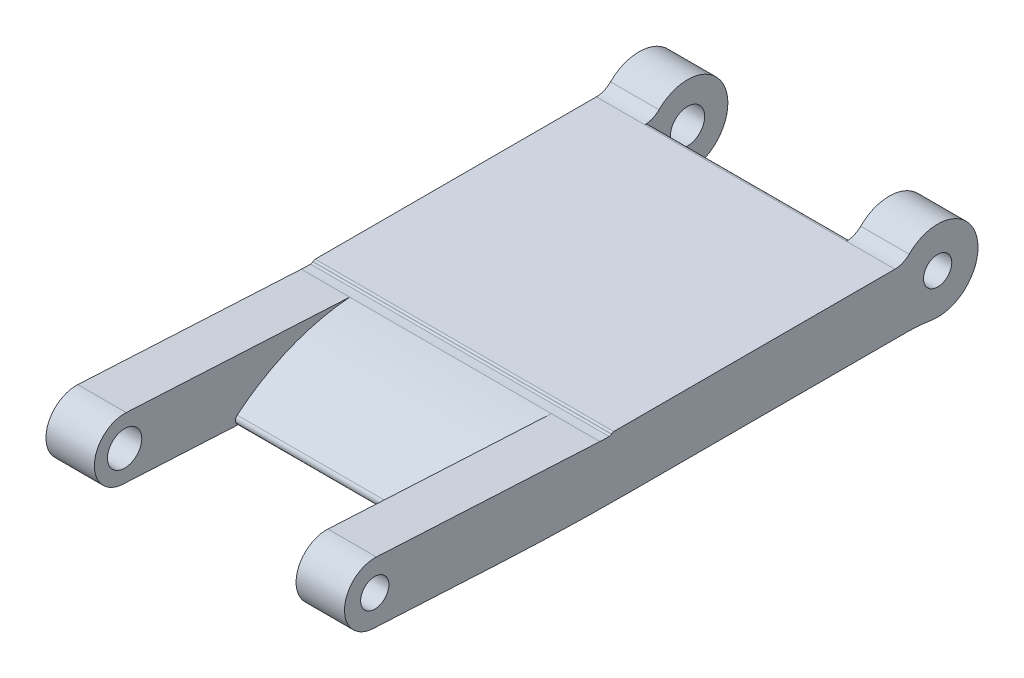
ISO-10303-21;
HEADER;
FILE_DESCRIPTION(('STEP AP214'),'2;1');
FILE_NAME('part.step','',(''),(''),'','','');
FILE_SCHEMA(('AUTOMOTIVE_DESIGN { 1 0 10303 214 1 1 1 1 }'));
ENDSEC;
DATA;
#1=APPLICATION_CONTEXT('core data for automotive mechanical design processes');
#2=APPLICATION_PROTOCOL_DEFINITION('international standard','automotive_design',2000,#1);
#3=PRODUCT_CONTEXT('',#1,'mechanical');
#4=PRODUCT('Part','Part','',(#3));
#5=PRODUCT_RELATED_PRODUCT_CATEGORY('part','',(#4));
#6=PRODUCT_DEFINITION_FORMATION('','',#4);
#7=PRODUCT_DEFINITION_CONTEXT('part definition',#1,'design');
#8=PRODUCT_DEFINITION('design','',#6,#7);
#9=PRODUCT_DEFINITION_SHAPE('','',#8);
#10=(LENGTH_UNIT() NAMED_UNIT(*) SI_UNIT(.MILLI.,.METRE.));
#11=(NAMED_UNIT(*) PLANE_ANGLE_UNIT() SI_UNIT($,.RADIAN.));
#12=(NAMED_UNIT(*) SI_UNIT($,.STERADIAN.) SOLID_ANGLE_UNIT());
#13=UNCERTAINTY_MEASURE_WITH_UNIT(LENGTH_MEASURE(1.E-05),#10,'distance_accuracy_value','');
#14=(GEOMETRIC_REPRESENTATION_CONTEXT(3) GLOBAL_UNCERTAINTY_ASSIGNED_CONTEXT((#13)) GLOBAL_UNIT_ASSIGNED_CONTEXT((#10,
#11,#12)) REPRESENTATION_CONTEXT('',''));
#15=CARTESIAN_POINT('',(0.,0.,0.));
#16=DIRECTION('',(0.,0.,1.));
#17=DIRECTION('',(1.,0.,0.));
#18=AXIS2_PLACEMENT_3D('',#15,#16,#17);
#19=CARTESIAN_POINT('',(12.533154362619,-35.1057047262083,-0.377323929196616));
#20=DIRECTION('',(-1.,0.,0.));
#21=DIRECTION('',(0.,0.,1.));
#22=AXIS2_PLACEMENT_3D('',#19,#20,#21);
#23=CYLINDRICAL_SURFACE('',#22,20.);
#24=DIRECTION('',(-1.,0.,0.));
#25=VECTOR('',#24,1.);
#26=CARTESIAN_POINT('',(12.533154362619,-19.7242130805713,12.4058570033882));
#27=LINE('',#26,#25);
#28=CARTESIAN_POINT('',(-30.,-19.7242130805713,12.4058570033882));
#29=VERTEX_POINT('',#28);
#30=CARTESIAN_POINT('',(-50.,-19.7242130805713,12.4058570033882));
#31=VERTEX_POINT('',#30);
#32=EDGE_CURVE('E337',#29,#31,#27,.T.);
#33=ORIENTED_EDGE('',*,*,#32,.F.);
#34=CARTESIAN_POINT('',(-30.,-35.1057047262083,-0.377323929196616));
#35=DIRECTION('',(1.,0.,0.));
#36=DIRECTION('',(0.,0.,-1.));
#37=AXIS2_PLACEMENT_3D('',#34,#35,#36);
#38=CIRCLE('',#37,20.);
#39=CARTESIAN_POINT('',(-30.,-15.1722620454143,1.25297140953795));
#40=VERTEX_POINT('',#39);
#41=EDGE_CURVE('E318',#29,#40,#38,.F.);
#42=ORIENTED_EDGE('',*,*,#41,.T.);
#43=DIRECTION('',(-1.,0.,0.));
#44=VECTOR('',#43,1.);
#45=CARTESIAN_POINT('',(12.533154362619,-15.1722620454143,1.25297140953794));
#46=LINE('',#45,#44);
#47=CARTESIAN_POINT('',(-50.,-15.1722620454143,1.25297140953795));
#48=VERTEX_POINT('',#47);
#49=EDGE_CURVE('E321',#40,#48,#46,.T.);
#50=ORIENTED_EDGE('',*,*,#49,.T.);
#51=CARTESIAN_POINT('',(-50.,-35.1057047262083,-0.377323929196616));
#52=DIRECTION('',(1.,0.,0.));
#53=DIRECTION('',(0.,0.,-1.));
#54=AXIS2_PLACEMENT_3D('',#51,#52,#53);
#55=CIRCLE('',#54,20.);
#56=EDGE_CURVE('E237',#31,#48,#55,.F.);
#57=ORIENTED_EDGE('',*,*,#56,.F.);
#58=EDGE_LOOP('',(#33,#42,#50,#57));
#59=FACE_BOUND('',#58,.T.);
#60=ADVANCED_FACE('F41',(#59),#23,.T.);
#61=CARTESIAN_POINT('',(12.533154362619,4.8,0.199999999999991));
#62=DIRECTION('',(-1.,0.,0.));
#63=DIRECTION('',(0.,0.,1.));
#64=AXIS2_PLACEMENT_3D('',#61,#62,#63);
#65=CYLINDRICAL_SURFACE('',#64,20.);
#66=CARTESIAN_POINT('',(-25.2,4.8,0.199999999999991));
#67=DIRECTION('',(1.,0.,0.));
#68=DIRECTION('',(0.,0.,-1.));
#69=AXIS2_PLACEMENT_3D('',#66,#67,#68);
#70=CIRCLE('',#69,20.);
#71=CARTESIAN_POINT('',(-25.2,-15.1722620454143,1.25297140953795));
#72=VERTEX_POINT('',#71);
#73=CARTESIAN_POINT('',(-25.2,-15.1996046002679,0.32576101520381));
#74=VERTEX_POINT('',#73);
#75=EDGE_CURVE('E284',#72,#74,#70,.T.);
#76=ORIENTED_EDGE('',*,*,#75,.T.);
#77=DIRECTION('',(-1.,0.,0.));
#78=VECTOR('',#77,1.);
#79=CARTESIAN_POINT('',(12.533154362619,-15.1996046002679,0.32576101520381));
#80=LINE('',#79,#78);
#81=CARTESIAN_POINT('',(-54.8,-15.1996046002679,0.32576101520381));
#82=VERTEX_POINT('',#81);
#83=EDGE_CURVE('E348',#74,#82,#80,.T.);
#84=ORIENTED_EDGE('',*,*,#83,.T.);
#85=CARTESIAN_POINT('',(-54.8,4.8,0.199999999999991));
#86=DIRECTION('',(1.,0.,0.));
#87=DIRECTION('',(0.,0.,-1.));
#88=AXIS2_PLACEMENT_3D('',#85,#86,#87);
#89=CIRCLE('',#88,20.);
#90=CARTESIAN_POINT('',(-54.8,-15.1722620454143,1.25297140953795));
#91=VERTEX_POINT('',#90);
#92=EDGE_CURVE('E228',#91,#82,#89,.T.);
#93=ORIENTED_EDGE('',*,*,#92,.F.);
#94=DIRECTION('',(1.,0.,0.));
#95=VECTOR('',#94,1.);
#96=CARTESIAN_POINT('',(-54.8,-15.1722620454143,1.25297140953795));
#97=LINE('',#96,#95);
#98=EDGE_CURVE('E244',#91,#48,#97,.T.);
#99=ORIENTED_EDGE('',*,*,#98,.T.);
#100=ORIENTED_EDGE('',*,*,#49,.F.);
#101=DIRECTION('',(-1.,0.,0.));
#102=VECTOR('',#101,1.);
#103=CARTESIAN_POINT('',(-25.2,-15.1722620454143,1.25297140953795));
#104=LINE('',#103,#102);
#105=EDGE_CURVE('E302',#72,#40,#104,.T.);
#106=ORIENTED_EDGE('',*,*,#105,.F.);
#107=EDGE_LOOP('',(#76,#84,#93,#99,#100,#106));
#108=FACE_BOUND('',#107,.T.);
#109=ADVANCED_FACE('F368',(#108),#65,.F.);
#110=CARTESIAN_POINT('',(12.533154362619,-7.49999999999961,-7.5));
#111=DIRECTION('',(0.,-0.707106781186529,-0.707106781186566));
#112=DIRECTION('',(0.,0.707106781186566,-0.707106781186529));
#113=AXIS2_PLACEMENT_3D('',#110,#111,#112);
#114=PLANE('',#113);
#115=DIRECTION('',(-1.,0.,0.));
#116=VECTOR('',#115,1.);
#117=CARTESIAN_POINT('',(-40.,-15.087867965644,0.0878679656440336));
#118=LINE('',#117,#116);
#119=CARTESIAN_POINT('',(-25.2,-15.087867965644,0.0878679656440336));
#120=VERTEX_POINT('',#119);
#121=CARTESIAN_POINT('',(-54.8,-15.087867965644,0.0878679656440336));
#122=VERTEX_POINT('',#121);
#123=EDGE_CURVE('E350',#120,#122,#118,.T.);
#124=ORIENTED_EDGE('',*,*,#123,.T.);
#125=DIRECTION('',(0.,0.707106781186566,-0.707106781186529));
#126=VECTOR('',#125,1.);
#127=CARTESIAN_POINT('',(-54.8,-7.49999999999961,-7.5));
#128=LINE('',#127,#126);
#129=CARTESIAN_POINT('',(-54.8,-15.1117425656198,0.111742565619788));
#130=VERTEX_POINT('',#129);
#131=EDGE_CURVE('E221',#130,#122,#128,.T.);
#132=ORIENTED_EDGE('',*,*,#131,.F.);
#133=DIRECTION('',(-1.,0.,0.));
#134=VECTOR('',#133,1.);
#135=CARTESIAN_POINT('',(12.533154362619,-15.1117425656198,0.111742565619788));
#136=LINE('',#135,#134);
#137=CARTESIAN_POINT('',(-25.2,-15.1117425656198,0.111742565619788));
#138=VERTEX_POINT('',#137);
#139=EDGE_CURVE('E352',#130,#138,#136,.F.);
#140=ORIENTED_EDGE('',*,*,#139,.T.);
#141=DIRECTION('',(0.,0.707106781186566,-0.707106781186529));
#142=VECTOR('',#141,1.);
#143=CARTESIAN_POINT('',(-25.2,-7.49999999999961,-7.5));
#144=LINE('',#143,#142);
#145=EDGE_CURVE('E258',#138,#120,#144,.T.);
#146=ORIENTED_EDGE('',*,*,#145,.T.);
#147=EDGE_LOOP('',(#124,#132,#140,#146));
#148=FACE_BOUND('',#147,.T.);
#149=ADVANCED_FACE('F356',(#148),#114,.F.);
#150=CARTESIAN_POINT('',(12.533154362619,-15.,0.));
#151=DIRECTION('',(0.,1.,0.));
#152=DIRECTION('',(0.,0.,1.));
#153=AXIS2_PLACEMENT_3D('',#150,#151,#152);
#154=PLANE('',#153);
#155=DIRECTION('',(-1.,0.,0.));
#156=VECTOR('',#155,1.);
#157=CARTESIAN_POINT('',(12.533154362619,-15.,-28.));
#158=LINE('',#157,#156);
#159=CARTESIAN_POINT('',(-30.,-15.,-28.));
#160=VERTEX_POINT('',#159);
#161=CARTESIAN_POINT('',(-50.,-15.,-28.));
#162=VERTEX_POINT('',#161);
#163=EDGE_CURVE('E226',#160,#162,#158,.T.);
#164=ORIENTED_EDGE('',*,*,#163,.T.);
#165=DIRECTION('',(1.,0.,0.));
#166=VECTOR('',#165,1.);
#167=CARTESIAN_POINT('',(-54.8,-15.,-28.));
#168=LINE('',#167,#166);
#169=CARTESIAN_POINT('',(-54.8,-15.,-28.));
#170=VERTEX_POINT('',#169);
#171=EDGE_CURVE('E207',#170,#162,#168,.T.);
#172=ORIENTED_EDGE('',*,*,#171,.F.);
#173=DIRECTION('',(0.,0.,1.));
#174=VECTOR('',#173,1.);
#175=CARTESIAN_POINT('',(-54.8,-15.,0.));
#176=LINE('',#175,#174);
#177=CARTESIAN_POINT('',(-54.8,-15.,-0.124264068711936));
#178=VERTEX_POINT('',#177);
#179=EDGE_CURVE('E213',#170,#178,#176,.T.);
#180=ORIENTED_EDGE('',*,*,#179,.T.);
#181=DIRECTION('',(-1.,0.,0.));
#182=VECTOR('',#181,1.);
#183=CARTESIAN_POINT('',(-25.2,-15.,-0.124264068711936));
#184=LINE('',#183,#182);
#185=CARTESIAN_POINT('',(-25.2,-15.,-0.124264068711936));
#186=VERTEX_POINT('',#185);
#187=EDGE_CURVE('E56',#178,#186,#184,.F.);
#188=ORIENTED_EDGE('',*,*,#187,.T.);
#189=DIRECTION('',(0.,0.,1.));
#190=VECTOR('',#189,1.);
#191=CARTESIAN_POINT('',(-25.2,-15.,0.));
#192=LINE('',#191,#190);
#193=CARTESIAN_POINT('',(-25.2,-15.,-28.));
#194=VERTEX_POINT('',#193);
#195=EDGE_CURVE('E260',#194,#186,#192,.T.);
#196=ORIENTED_EDGE('',*,*,#195,.F.);
#197=DIRECTION('',(-1.,0.,0.));
#198=VECTOR('',#197,1.);
#199=CARTESIAN_POINT('',(-25.2,-15.,-28.));
#200=LINE('',#199,#198);
#201=EDGE_CURVE('E287',#194,#160,#200,.T.);
#202=ORIENTED_EDGE('',*,*,#201,.T.);
#203=EDGE_LOOP('',(#164,#172,#180,#188,#196,#202));
#204=FACE_BOUND('',#203,.T.);
#205=ADVANCED_FACE('F223',(#204),#154,.T.);
#206=CARTESIAN_POINT('',(12.533154362619,-15.4182630627142,-28.));
#207=DIRECTION('',(-1.,0.,0.));
#208=DIRECTION('',(0.,0.,1.));
#209=AXIS2_PLACEMENT_3D('',#206,#207,#208);
#210=CYLINDRICAL_SURFACE('',#209,0.418263062714168);
#211=ORIENTED_EDGE('',*,*,#163,.F.);
#212=CARTESIAN_POINT('',(-30.,-15.4182630627142,-28.));
#213=DIRECTION('',(1.,0.,0.));
#214=DIRECTION('',(0.,0.,-1.));
#215=AXIS2_PLACEMENT_3D('',#212,#213,#214);
#216=CIRCLE('',#215,0.418263062714168);
#217=CARTESIAN_POINT('',(-30.,-15.5834917996589,-28.3842440033607));
#218=VERTEX_POINT('',#217);
#219=EDGE_CURVE('E332',#160,#218,#216,.F.);
#220=ORIENTED_EDGE('',*,*,#219,.T.);
#221=DIRECTION('',(-1.,0.,0.));
#222=VECTOR('',#221,1.);
#223=CARTESIAN_POINT('',(12.533154362619,-15.5834917996589,-28.3842440033607));
#224=LINE('',#223,#222);
#225=CARTESIAN_POINT('',(-50.,-15.5834917996589,-28.3842440033607));
#226=VERTEX_POINT('',#225);
#227=EDGE_CURVE('E331',#218,#226,#224,.T.);
#228=ORIENTED_EDGE('',*,*,#227,.T.);
#229=CARTESIAN_POINT('',(-50.,-15.4182630627142,-28.));
#230=DIRECTION('',(1.,0.,0.));
#231=DIRECTION('',(0.,0.,-1.));
#232=AXIS2_PLACEMENT_3D('',#229,#230,#231);
#233=CIRCLE('',#232,0.418263062714168);
#234=EDGE_CURVE('E240',#162,#226,#233,.F.);
#235=ORIENTED_EDGE('',*,*,#234,.F.);
#236=EDGE_LOOP('',(#211,#220,#228,#235));
#237=FACE_BOUND('',#236,.T.);
#238=ADVANCED_FACE('F414',(#237),#210,.T.);
#239=CARTESIAN_POINT('',(12.533154362619,-17.2426406871193,-32.2426406871193));
#240=DIRECTION('',(-1.,0.,0.));
#241=DIRECTION('',(0.,0.,1.));
#242=AXIS2_PLACEMENT_3D('',#239,#240,#241);
#243=CYLINDRICAL_SURFACE('',#242,4.2);
#244=ORIENTED_EDGE('',*,*,#227,.F.);
#245=CARTESIAN_POINT('',(-30.,-17.2426406871193,-32.2426406871193));
#246=DIRECTION('',(1.,0.,0.));
#247=DIRECTION('',(0.,0.,-1.));
#248=AXIS2_PLACEMENT_3D('',#245,#246,#247);
#249=CIRCLE('',#248,4.2);
#250=CARTESIAN_POINT('',(-30.,-20.3320909868384,-29.3974171729529));
#251=VERTEX_POINT('',#250);
#252=EDGE_CURVE('E328',#218,#251,#249,.T.);
#253=ORIENTED_EDGE('',*,*,#252,.T.);
#254=DIRECTION('',(-1.,0.,0.));
#255=VECTOR('',#254,1.);
#256=CARTESIAN_POINT('',(12.533154362619,-20.3320909868384,-29.3974171729529));
#257=LINE('',#256,#255);
#258=CARTESIAN_POINT('',(-50.,-20.3320909868384,-29.3974171729529));
#259=VERTEX_POINT('',#258);
#260=EDGE_CURVE('E327',#251,#259,#257,.T.);
#261=ORIENTED_EDGE('',*,*,#260,.T.);
#262=CARTESIAN_POINT('',(-50.,-17.2426406871193,-32.2426406871193));
#263=DIRECTION('',(1.,0.,0.));
#264=DIRECTION('',(0.,0.,-1.));
#265=AXIS2_PLACEMENT_3D('',#262,#263,#264);
#266=CIRCLE('',#265,4.2);
#267=EDGE_CURVE('E248',#226,#259,#266,.T.);
#268=ORIENTED_EDGE('',*,*,#267,.F.);
#269=EDGE_LOOP('',(#244,#253,#261,#268));
#270=FACE_BOUND('',#269,.T.);
#271=ADVANCED_FACE('F462',(#270),#243,.F.);
#272=CARTESIAN_POINT('',(12.533154362619,-20.6151674351375,-29.136718443771));
#273=DIRECTION('',(-1.,0.,0.));
#274=DIRECTION('',(0.,0.,1.));
#275=AXIS2_PLACEMENT_3D('',#272,#273,#274);
#276=CYLINDRICAL_SURFACE('',#275,0.384832564862518);
#277=ORIENTED_EDGE('',*,*,#260,.F.);
#278=CARTESIAN_POINT('',(-30.,-20.6151674351375,-29.136718443771));
#279=DIRECTION('',(1.,0.,0.));
#280=DIRECTION('',(0.,0.,-1.));
#281=AXIS2_PLACEMENT_3D('',#278,#279,#280);
#282=CIRCLE('',#281,0.384832564862518);
#283=CARTESIAN_POINT('',(-30.,-21.,-29.136718443771));
#284=VERTEX_POINT('',#283);
#285=EDGE_CURVE('E323',#251,#284,#282,.F.);
#286=ORIENTED_EDGE('',*,*,#285,.T.);
#287=DIRECTION('',(-1.,0.,0.));
#288=VECTOR('',#287,1.);
#289=CARTESIAN_POINT('',(12.533154362619,-21.,-29.136718443771));
#290=LINE('',#289,#288);
#291=CARTESIAN_POINT('',(-50.,-21.,-29.136718443771));
#292=VERTEX_POINT('',#291);
#293=EDGE_CURVE('E326',#284,#292,#290,.T.);
#294=ORIENTED_EDGE('',*,*,#293,.T.);
#295=CARTESIAN_POINT('',(-50.,-20.6151674351375,-29.136718443771));
#296=DIRECTION('',(1.,0.,0.));
#297=DIRECTION('',(0.,0.,-1.));
#298=AXIS2_PLACEMENT_3D('',#295,#296,#297);
#299=CIRCLE('',#298,0.384832564862518);
#300=EDGE_CURVE('E245',#259,#292,#299,.F.);
#301=ORIENTED_EDGE('',*,*,#300,.F.);
#302=EDGE_LOOP('',(#277,#286,#294,#301));
#303=FACE_BOUND('',#302,.T.);
#304=ADVANCED_FACE('F460',(#303),#276,.T.);
#305=CARTESIAN_POINT('',(12.533154362619,-21.,0.));
#306=DIRECTION('',(0.,1.,0.));
#307=DIRECTION('',(0.,0.,1.));
#308=AXIS2_PLACEMENT_3D('',#305,#306,#307);
#309=PLANE('',#308);
#310=ORIENTED_EDGE('',*,*,#293,.F.);
#311=DIRECTION('',(-1.,0.,0.));
#312=VECTOR('',#311,1.);
#313=CARTESIAN_POINT('',(-25.2,-21.,-29.136718443771));
#314=LINE('',#313,#312);
#315=CARTESIAN_POINT('',(-25.2,-21.,-29.136718443771));
#316=VERTEX_POINT('',#315);
#317=EDGE_CURVE('E311',#316,#284,#314,.T.);
#318=ORIENTED_EDGE('',*,*,#317,.F.);
#319=DIRECTION('',(0.,0.,1.));
#320=VECTOR('',#319,1.);
#321=CARTESIAN_POINT('',(-25.2,-21.,0.));
#322=LINE('',#321,#320);
#323=CARTESIAN_POINT('',(-25.2,-21.,-1.9072266521393));
#324=VERTEX_POINT('',#323);
#325=EDGE_CURVE('E271',#316,#324,#322,.T.);
#326=ORIENTED_EDGE('',*,*,#325,.T.);
#327=DIRECTION('',(-1.,0.,0.));
#328=VECTOR('',#327,1.);
#329=CARTESIAN_POINT('',(12.533154362619,-21.,-1.90722665213932));
#330=LINE('',#329,#328);
#331=CARTESIAN_POINT('',(-54.8,-21.,-1.9072266521393));
#332=VERTEX_POINT('',#331);
#333=EDGE_CURVE('E340',#324,#332,#330,.T.);
#334=ORIENTED_EDGE('',*,*,#333,.T.);
#335=DIRECTION('',(0.,0.,1.));
#336=VECTOR('',#335,1.);
#337=CARTESIAN_POINT('',(-54.8,-21.,0.));
#338=LINE('',#337,#336);
#339=CARTESIAN_POINT('',(-54.8,-21.,-29.136718443771));
#340=VERTEX_POINT('',#339);
#341=EDGE_CURVE('E1009',#340,#332,#338,.T.);
#342=ORIENTED_EDGE('',*,*,#341,.F.);
#343=DIRECTION('',(1.,0.,0.));
#344=VECTOR('',#343,1.);
#345=CARTESIAN_POINT('',(-54.8,-21.,-29.136718443771));
#346=LINE('',#345,#344);
#347=EDGE_CURVE('E450',#340,#292,#346,.T.);
#348=ORIENTED_EDGE('',*,*,#347,.T.);
#349=EDGE_LOOP('',(#310,#318,#326,#334,#342,#348));
#350=FACE_BOUND('',#349,.T.);
#351=ADVANCED_FACE('F392',(#350),#309,.F.);
#352=CARTESIAN_POINT('',(12.533154362619,229.,-1.90722665213935));
#353=DIRECTION('',(-1.,0.,0.));
#354=DIRECTION('',(0.,0.,1.));
#355=AXIS2_PLACEMENT_3D('',#352,#353,#354);
#356=CYLINDRICAL_SURFACE('',#355,250.);
#357=ORIENTED_EDGE('',*,*,#333,.F.);
#358=CARTESIAN_POINT('',(-25.2,229.,-1.90722665213935));
#359=DIRECTION('',(1.,0.,0.));
#360=DIRECTION('',(0.,0.,-1.));
#361=AXIS2_PLACEMENT_3D('',#358,#359,#360);
#362=CIRCLE('',#361,250.);
#363=CARTESIAN_POINT('',(-25.2,-20.6532755676785,11.2549159670851));
#364=VERTEX_POINT('',#363);
#365=EDGE_CURVE('E274',#364,#324,#362,.T.);
#366=ORIENTED_EDGE('',*,*,#365,.F.);
#367=DIRECTION('',(-1.,0.,0.));
#368=VECTOR('',#367,1.);
#369=CARTESIAN_POINT('',(12.533154362619,-20.6532755676785,11.254915967085));
#370=LINE('',#369,#368);
#371=CARTESIAN_POINT('',(-54.8,-20.6532755676785,11.2549159670851));
#372=VERTEX_POINT('',#371);
#373=EDGE_CURVE('E338',#364,#372,#370,.T.);
#374=ORIENTED_EDGE('',*,*,#373,.T.);
#375=CARTESIAN_POINT('',(-54.8,229.,-1.90722665213935));
#376=DIRECTION('',(1.,0.,0.));
#377=DIRECTION('',(0.,0.,-1.));
#378=AXIS2_PLACEMENT_3D('',#375,#376,#377);
#379=CIRCLE('',#378,250.);
#380=EDGE_CURVE('E1012',#372,#332,#379,.T.);
#381=ORIENTED_EDGE('',*,*,#380,.T.);
#382=EDGE_LOOP('',(#357,#366,#374,#381));
#383=FACE_BOUND('',#382,.T.);
#384=ADVANCED_FACE('F508',(#383),#356,.T.);
#385=CARTESIAN_POINT('',(12.533154362619,-21.187760754969,1.11705455578255));
#386=DIRECTION('',(0.,0.998613102270714,-0.0526485704768981));
#387=DIRECTION('',(0.,0.0526485704768981,0.998613102270714));
#388=AXIS2_PLACEMENT_3D('',#385,#386,#387);
#389=PLANE('',#388);
#390=ORIENTED_EDGE('',*,*,#373,.F.);
#391=DIRECTION('',(0.,0.0526485704768981,0.998613102270714));
#392=VECTOR('',#391,1.);
#393=CARTESIAN_POINT('',(-25.2,-21.187760754969,1.11705455578255));
#394=LINE('',#393,#392);
#395=CARTESIAN_POINT('',(-25.2,-19.9958393068121,23.7248549998467));
#396=VERTEX_POINT('',#395);
#397=EDGE_CURVE('E277',#364,#396,#394,.T.);
#398=ORIENTED_EDGE('',*,*,#397,.T.);
#399=DIRECTION('',(-1.,0.,0.));
#400=VECTOR('',#399,1.);
#401=CARTESIAN_POINT('',(-25.2,-19.9958393068121,23.7248549998467));
#402=LINE('',#401,#400);
#403=CARTESIAN_POINT('',(-30.,-19.9958393068121,23.7248549998467));
#404=VERTEX_POINT('',#403);
#405=EDGE_CURVE('E308',#396,#404,#402,.T.);
#406=ORIENTED_EDGE('',*,*,#405,.T.);
#407=DIRECTION('',(0.,0.0526485704768981,0.998613102270714));
#408=VECTOR('',#407,1.);
#409=CARTESIAN_POINT('',(-30.,-21.187760754969,1.11705455578255));
#410=LINE('',#409,#408);
#411=CARTESIAN_POINT('',(-30.,-20.6080569228476,12.1126017653121));
#412=VERTEX_POINT('',#411);
#413=EDGE_CURVE('E296',#412,#404,#410,.T.);
#414=ORIENTED_EDGE('',*,*,#413,.F.);
#415=DIRECTION('',(-1.,0.,0.));
#416=VECTOR('',#415,1.);
#417=CARTESIAN_POINT('',(12.533154362619,-20.6080569228476,12.1126017653121));
#418=LINE('',#417,#416);
#419=CARTESIAN_POINT('',(-50.,-20.6080569228476,12.1126017653121));
#420=VERTEX_POINT('',#419);
#421=EDGE_CURVE('E335',#412,#420,#418,.T.);
#422=ORIENTED_EDGE('',*,*,#421,.T.);
#423=DIRECTION('',(0.,0.0526485704768981,0.998613102270714));
#424=VECTOR('',#423,1.);
#425=CARTESIAN_POINT('',(-50.,-21.187760754969,1.11705455578255));
#426=LINE('',#425,#424);
#427=CARTESIAN_POINT('',(-50.,-19.9958393068121,23.7248549998467));
#428=VERTEX_POINT('',#427);
#429=EDGE_CURVE('E436',#420,#428,#426,.T.);
#430=ORIENTED_EDGE('',*,*,#429,.T.);
#431=DIRECTION('',(1.,0.,0.));
#432=VECTOR('',#431,1.);
#433=CARTESIAN_POINT('',(-54.8,-19.9958393068121,23.7248549998467));
#434=LINE('',#433,#432);
#435=CARTESIAN_POINT('',(-54.8,-19.9958393068121,23.7248549998467));
#436=VERTEX_POINT('',#435);
#437=EDGE_CURVE('E447',#436,#428,#434,.T.);
#438=ORIENTED_EDGE('',*,*,#437,.F.);
#439=DIRECTION('',(0.,0.0526485704768981,0.998613102270714));
#440=VECTOR('',#439,1.);
#441=CARTESIAN_POINT('',(-54.8,-21.187760754969,1.11705455578255));
#442=LINE('',#441,#440);
#443=EDGE_CURVE('E1014',#372,#436,#442,.T.);
#444=ORIENTED_EDGE('',*,*,#443,.F.);
#445=EDGE_LOOP('',(#390,#398,#406,#414,#422,#430,#438,#444));
#446=FACE_BOUND('',#445,.T.);
#447=ADVANCED_FACE('F384',(#446),#389,.F.);
#448=CARTESIAN_POINT('',(12.533154362619,-20.1087503717123,12.0862774800736));
#449=DIRECTION('',(-1.,0.,0.));
#450=DIRECTION('',(0.,0.,1.));
#451=AXIS2_PLACEMENT_3D('',#448,#449,#450);
#452=CYLINDRICAL_SURFACE('',#451,0.500000000000001);
#453=CARTESIAN_POINT('',(-30.,-20.1087503717123,12.0862774800736));
#454=DIRECTION('',(1.,0.,0.));
#455=DIRECTION('',(0.,0.,-1.));
#456=AXIS2_PLACEMENT_3D('',#453,#454,#455);
#457=CIRCLE('',#456,0.500000000000001);
#458=EDGE_CURVE('E304',#29,#412,#457,.T.);
#459=ORIENTED_EDGE('',*,*,#458,.F.);
#460=ORIENTED_EDGE('',*,*,#32,.T.);
#461=CARTESIAN_POINT('',(-50.,-20.1087503717123,12.0862774800736));
#462=DIRECTION('',(1.,0.,0.));
#463=DIRECTION('',(0.,0.,-1.));
#464=AXIS2_PLACEMENT_3D('',#461,#462,#463);
#465=CIRCLE('',#464,0.500000000000001);
#466=EDGE_CURVE('E241',#31,#420,#465,.T.);
#467=ORIENTED_EDGE('',*,*,#466,.T.);
#468=ORIENTED_EDGE('',*,*,#421,.F.);
#469=EDGE_LOOP('',(#459,#460,#467,#468));
#470=FACE_BOUND('',#469,.T.);
#471=ADVANCED_FACE('F501',(#470),#452,.T.);
#472=CARTESIAN_POINT('',(-30.,-13.,-28.));
#473=DIRECTION('',(1.,0.,0.));
#474=DIRECTION('',(0.,0.,-1.));
#475=AXIS2_PLACEMENT_3D('',#472,#473,#474);
#476=PLANE('',#475);
#477=ORIENTED_EDGE('',*,*,#41,.F.);
#478=ORIENTED_EDGE('',*,*,#458,.T.);
#479=ORIENTED_EDGE('',*,*,#413,.T.);
#480=CARTESIAN_POINT('',(-30.,-17.,23.566909288416));
#481=DIRECTION('',(1.,0.,0.));
#482=DIRECTION('',(0.,0.,-1.));
#483=AXIS2_PLACEMENT_3D('',#480,#481,#482);
#484=CIRCLE('',#483,3.);
#485=CARTESIAN_POINT('',(-30.,-14.0041606931879,23.4089635769853));
#486=VERTEX_POINT('',#485);
#487=EDGE_CURVE('E298',#486,#404,#484,.T.);
#488=ORIENTED_EDGE('',*,*,#487,.F.);
#489=DIRECTION('',(0.,0.0526485704768976,0.998613102270714));
#490=VECTOR('',#489,1.);
#491=CARTESIAN_POINT('',(-30.,-15.1960821413447,0.80116313292115));
#492=LINE('',#491,#490);
#493=EDGE_CURVE('E261',#40,#486,#492,.T.);
#494=ORIENTED_EDGE('',*,*,#493,.F.);
#495=EDGE_LOOP('',(#477,#478,#479,#488,#494));
#496=FACE_BOUND('',#495,.T.);
#497=CARTESIAN_POINT('',(-30.,-17.,23.566909288416));
#498=DIRECTION('',(1.,0.,0.));
#499=DIRECTION('',(0.,0.,-1.));
#500=AXIS2_PLACEMENT_3D('',#497,#498,#499);
#501=CIRCLE('',#500,1.4);
#502=CARTESIAN_POINT('',(-30.,-17.,22.166909288416));
#503=VERTEX_POINT('',#502);
#504=EDGE_CURVE('E984',#503,#503,#501,.F.);
#505=ORIENTED_EDGE('',*,*,#504,.F.);
#506=EDGE_LOOP('',(#505));
#507=FACE_BOUND('',#506,.T.);
#508=ADVANCED_FACE('F504',(#496,#507),#476,.F.);
#509=CARTESIAN_POINT('',(-25.2,-13.,-28.));
#510=DIRECTION('',(1.,0.,0.));
#511=DIRECTION('',(0.,0.,-1.));
#512=AXIS2_PLACEMENT_3D('',#509,#510,#511);
#513=PLANE('',#512);
#514=ORIENTED_EDGE('',*,*,#195,.T.);
#515=CARTESIAN_POINT('',(-25.2,-15.3,-0.124264068711936));
#516=DIRECTION('',(1.,0.,0.));
#517=DIRECTION('',(0.,0.,-1.));
#518=AXIS2_PLACEMENT_3D('',#515,#516,#517);
#519=CIRCLE('',#518,0.3);
#520=EDGE_CURVE('E49',#186,#120,#519,.T.);
#521=ORIENTED_EDGE('',*,*,#520,.T.);
#522=ORIENTED_EDGE('',*,*,#145,.F.);
#523=CARTESIAN_POINT('',(-25.2,-14.8996105312638,0.323874599975753));
#524=DIRECTION('',(1.,0.,0.));
#525=DIRECTION('',(0.,0.,-1.));
#526=AXIS2_PLACEMENT_3D('',#523,#524,#525);
#527=CIRCLE('',#526,0.3);
#528=EDGE_CURVE('E11',#138,#74,#527,.F.);
#529=ORIENTED_EDGE('',*,*,#528,.T.);
#530=ORIENTED_EDGE('',*,*,#75,.F.);
#531=DIRECTION('',(0.,0.0526485704768976,0.998613102270714));
#532=VECTOR('',#531,1.);
#533=CARTESIAN_POINT('',(-25.2,-15.1960821413447,0.80116313292115));
#534=LINE('',#533,#532);
#535=CARTESIAN_POINT('',(-25.2,-14.0041606931879,23.4089635769853));
#536=VERTEX_POINT('',#535);
#537=EDGE_CURVE('E282',#72,#536,#534,.T.);
#538=ORIENTED_EDGE('',*,*,#537,.T.);
#539=CARTESIAN_POINT('',(-25.2,-17.,23.566909288416));
#540=DIRECTION('',(1.,0.,0.));
#541=DIRECTION('',(0.,0.,-1.));
#542=AXIS2_PLACEMENT_3D('',#539,#540,#541);
#543=CIRCLE('',#542,3.);
#544=EDGE_CURVE('E280',#536,#396,#543,.T.);
#545=ORIENTED_EDGE('',*,*,#544,.T.);
#546=ORIENTED_EDGE('',*,*,#397,.F.);
#547=ORIENTED_EDGE('',*,*,#365,.T.);
#548=ORIENTED_EDGE('',*,*,#325,.F.);
#549=CARTESIAN_POINT('',(-25.2,-37.,-29.136718443771));
#550=DIRECTION('',(1.,0.,0.));
#551=DIRECTION('',(0.,0.,-1.));
#552=AXIS2_PLACEMENT_3D('',#549,#550,#551);
#553=CIRCLE('',#552,16.);
#554=CARTESIAN_POINT('',(-25.2,-21.1941125496954,-31.6214562384496));
#555=VERTEX_POINT('',#554);
#556=EDGE_CURVE('E268',#555,#316,#553,.T.);
#557=ORIENTED_EDGE('',*,*,#556,.F.);
#558=CARTESIAN_POINT('',(-25.2,-17.2426406871193,-32.2426406871193));
#559=DIRECTION('',(1.,0.,0.));
#560=DIRECTION('',(0.,0.,-1.));
#561=AXIS2_PLACEMENT_3D('',#558,#559,#560);
#562=CIRCLE('',#561,4.);
#563=CARTESIAN_POINT('',(-25.2,-14.4142135623731,-29.4142135623731));
#564=VERTEX_POINT('',#563);
#565=EDGE_CURVE('E266',#555,#564,#562,.T.);
#566=ORIENTED_EDGE('',*,*,#565,.T.);
#567=CARTESIAN_POINT('',(-25.2,-13.,-28.));
#568=DIRECTION('',(1.,0.,0.));
#569=DIRECTION('',(0.,0.,-1.));
#570=AXIS2_PLACEMENT_3D('',#567,#568,#569);
#571=CIRCLE('',#570,2.);
#572=EDGE_CURVE('E263',#194,#564,#571,.T.);
#573=ORIENTED_EDGE('',*,*,#572,.F.);
#574=EDGE_LOOP('',(#514,#521,#522,#529,#530,#538,#545,#546,#547,#548,#557,#566,#573));
#575=FACE_BOUND('',#574,.T.);
#576=CARTESIAN_POINT('',(-25.2,-17.2426406871193,-32.2426406871193));
#577=DIRECTION('',(1.,0.,0.));
#578=DIRECTION('',(0.,0.,-1.));
#579=AXIS2_PLACEMENT_3D('',#576,#577,#578);
#580=CIRCLE('',#579,1.4);
#581=CARTESIAN_POINT('',(-25.2,-17.2426406871193,-33.6426406871193));
#582=VERTEX_POINT('',#581);
#583=EDGE_CURVE('E994',#582,#582,#580,.T.);
#584=ORIENTED_EDGE('',*,*,#583,.F.);
#585=EDGE_LOOP('',(#584));
#586=FACE_BOUND('',#585,.T.);
#587=CARTESIAN_POINT('',(-25.2,-17.,23.566909288416));
#588=DIRECTION('',(1.,0.,0.));
#589=DIRECTION('',(0.,0.,-1.));
#590=AXIS2_PLACEMENT_3D('',#587,#588,#589);
#591=CIRCLE('',#590,1.4);
#592=CARTESIAN_POINT('',(-25.2,-17.,22.166909288416));
#593=VERTEX_POINT('',#592);
#594=EDGE_CURVE('E987',#593,#593,#591,.T.);
#595=ORIENTED_EDGE('',*,*,#594,.F.);
#596=EDGE_LOOP('',(#595));
#597=FACE_BOUND('',#596,.T.);
#598=ADVANCED_FACE('F361',(#575,#586,#597),#513,.T.);
#599=ORIENTED_EDGE('',*,*,#285,.F.);
#600=ORIENTED_EDGE('',*,*,#252,.F.);
#601=ORIENTED_EDGE('',*,*,#219,.F.);
#602=CARTESIAN_POINT('',(-30.,-13.,-28.));
#603=DIRECTION('',(1.,0.,0.));
#604=DIRECTION('',(0.,0.,-1.));
#605=AXIS2_PLACEMENT_3D('',#602,#603,#604);
#606=CIRCLE('',#605,2.);
#607=CARTESIAN_POINT('',(-30.,-14.4142135623731,-29.4142135623731));
#608=VERTEX_POINT('',#607);
#609=EDGE_CURVE('E257',#160,#608,#606,.T.);
#610=ORIENTED_EDGE('',*,*,#609,.T.);
#611=CARTESIAN_POINT('',(-30.,-17.2426406871193,-32.2426406871193));
#612=DIRECTION('',(1.,0.,0.));
#613=DIRECTION('',(0.,0.,-1.));
#614=AXIS2_PLACEMENT_3D('',#611,#612,#613);
#615=CIRCLE('',#614,4.);
#616=CARTESIAN_POINT('',(-30.,-21.1941125496954,-31.6214562384496));
#617=VERTEX_POINT('',#616);
#618=EDGE_CURVE('E290',#617,#608,#615,.T.);
#619=ORIENTED_EDGE('',*,*,#618,.F.);
#620=CARTESIAN_POINT('',(-30.,-37.,-29.136718443771));
#621=DIRECTION('',(1.,0.,0.));
#622=DIRECTION('',(0.,0.,-1.));
#623=AXIS2_PLACEMENT_3D('',#620,#621,#622);
#624=CIRCLE('',#623,16.);
#625=EDGE_CURVE('E293',#617,#284,#624,.T.);
#626=ORIENTED_EDGE('',*,*,#625,.T.);
#627=EDGE_LOOP('',(#599,#600,#601,#610,#619,#626));
#628=FACE_BOUND('',#627,.T.);
#629=CARTESIAN_POINT('',(-30.,-17.2426406871193,-32.2426406871193));
#630=DIRECTION('',(1.,0.,0.));
#631=DIRECTION('',(0.,0.,-1.));
#632=AXIS2_PLACEMENT_3D('',#629,#630,#631);
#633=CIRCLE('',#632,1.4);
#634=CARTESIAN_POINT('',(-30.,-17.2426406871193,-33.6426406871193));
#635=VERTEX_POINT('',#634);
#636=EDGE_CURVE('E989',#635,#635,#633,.F.);
#637=ORIENTED_EDGE('',*,*,#636,.F.);
#638=EDGE_LOOP('',(#637));
#639=FACE_BOUND('',#638,.T.);
#640=ADVANCED_FACE('F401',(#628,#639),#476,.F.);
#641=CARTESIAN_POINT('',(-25.2,-15.1960821413447,0.80116313292115));
#642=DIRECTION('',(0.,-0.998613102270714,0.0526485704768976));
#643=DIRECTION('',(0.,-0.0526485704768976,-0.998613102270714));
#644=AXIS2_PLACEMENT_3D('',#641,#642,#643);
#645=PLANE('',#644);
#646=ORIENTED_EDGE('',*,*,#493,.T.);
#647=DIRECTION('',(-1.,0.,0.));
#648=VECTOR('',#647,1.);
#649=CARTESIAN_POINT('',(-25.2,-14.0041606931879,23.4089635769853));
#650=LINE('',#649,#648);
#651=EDGE_CURVE('E305',#536,#486,#650,.T.);
#652=ORIENTED_EDGE('',*,*,#651,.F.);
#653=ORIENTED_EDGE('',*,*,#537,.F.);
#654=ORIENTED_EDGE('',*,*,#105,.T.);
#655=EDGE_LOOP('',(#646,#652,#653,#654));
#656=FACE_BOUND('',#655,.T.);
#657=ADVANCED_FACE('F377',(#656),#645,.F.);
#658=CARTESIAN_POINT('',(-25.2,-17.,23.566909288416));
#659=DIRECTION('',(-1.,0.,0.));
#660=DIRECTION('',(0.,0.,1.));
#661=AXIS2_PLACEMENT_3D('',#658,#659,#660);
#662=CYLINDRICAL_SURFACE('',#661,3.);
#663=ORIENTED_EDGE('',*,*,#487,.T.);
#664=ORIENTED_EDGE('',*,*,#405,.F.);
#665=ORIENTED_EDGE('',*,*,#544,.F.);
#666=ORIENTED_EDGE('',*,*,#651,.T.);
#667=EDGE_LOOP('',(#663,#664,#665,#666));
#668=FACE_BOUND('',#667,.T.);
#669=ADVANCED_FACE('F381',(#668),#662,.T.);
#670=CARTESIAN_POINT('',(-25.2,-37.,-29.136718443771));
#671=DIRECTION('',(-1.,0.,0.));
#672=DIRECTION('',(0.,0.,1.));
#673=AXIS2_PLACEMENT_3D('',#670,#671,#672);
#674=CYLINDRICAL_SURFACE('',#673,16.);
#675=ORIENTED_EDGE('',*,*,#625,.F.);
#676=DIRECTION('',(-1.,0.,0.));
#677=VECTOR('',#676,1.);
#678=CARTESIAN_POINT('',(-25.2,-21.1941125496954,-31.6214562384496));
#679=LINE('',#678,#677);
#680=EDGE_CURVE('E313',#555,#617,#679,.T.);
#681=ORIENTED_EDGE('',*,*,#680,.F.);
#682=ORIENTED_EDGE('',*,*,#556,.T.);
#683=ORIENTED_EDGE('',*,*,#317,.T.);
#684=EDGE_LOOP('',(#675,#681,#682,#683));
#685=FACE_BOUND('',#684,.T.);
#686=ADVANCED_FACE('F398',(#685),#674,.F.);
#687=CARTESIAN_POINT('',(-25.2,-17.2426406871193,-32.2426406871193));
#688=DIRECTION('',(-1.,0.,0.));
#689=DIRECTION('',(0.,0.,1.));
#690=AXIS2_PLACEMENT_3D('',#687,#688,#689);
#691=CYLINDRICAL_SURFACE('',#690,4.);
#692=ORIENTED_EDGE('',*,*,#618,.T.);
#693=DIRECTION('',(-1.,0.,0.));
#694=VECTOR('',#693,1.);
#695=CARTESIAN_POINT('',(-25.2,-14.4142135623731,-29.4142135623731));
#696=LINE('',#695,#694);
#697=EDGE_CURVE('E315',#564,#608,#696,.T.);
#698=ORIENTED_EDGE('',*,*,#697,.F.);
#699=ORIENTED_EDGE('',*,*,#565,.F.);
#700=ORIENTED_EDGE('',*,*,#680,.T.);
#701=EDGE_LOOP('',(#692,#698,#699,#700));
#702=FACE_BOUND('',#701,.T.);
#703=ADVANCED_FACE('F407',(#702),#691,.T.);
#704=CARTESIAN_POINT('',(-25.2,-13.,-28.));
#705=DIRECTION('',(-1.,0.,0.));
#706=DIRECTION('',(0.,0.,1.));
#707=AXIS2_PLACEMENT_3D('',#704,#705,#706);
#708=CYLINDRICAL_SURFACE('',#707,2.);
#709=ORIENTED_EDGE('',*,*,#609,.F.);
#710=ORIENTED_EDGE('',*,*,#201,.F.);
#711=ORIENTED_EDGE('',*,*,#572,.T.);
#712=ORIENTED_EDGE('',*,*,#697,.T.);
#713=EDGE_LOOP('',(#709,#710,#711,#712));
#714=FACE_BOUND('',#713,.T.);
#715=ADVANCED_FACE('F411',(#714),#708,.F.);
#716=CARTESIAN_POINT('',(12.533154362619,-14.8996105312638,0.323874599975753));
#717=DIRECTION('',(-1.,0.,0.));
#718=DIRECTION('',(0.,0.,1.));
#719=AXIS2_PLACEMENT_3D('',#716,#717,#718);
#720=CYLINDRICAL_SURFACE('',#719,0.3);
#721=ORIENTED_EDGE('',*,*,#528,.F.);
#722=ORIENTED_EDGE('',*,*,#139,.F.);
#723=CARTESIAN_POINT('',(-54.8,-14.8996105312638,0.323874599975753));
#724=DIRECTION('',(1.,0.,0.));
#725=DIRECTION('',(0.,0.,-1.));
#726=AXIS2_PLACEMENT_3D('',#723,#724,#725);
#727=CIRCLE('',#726,0.3);
#728=EDGE_CURVE('E254',#130,#82,#727,.F.);
#729=ORIENTED_EDGE('',*,*,#728,.T.);
#730=ORIENTED_EDGE('',*,*,#83,.F.);
#731=EDGE_LOOP('',(#721,#722,#729,#730));
#732=FACE_BOUND('',#731,.T.);
#733=ADVANCED_FACE('F365',(#732),#720,.F.);
#734=CARTESIAN_POINT('',(12.533154362619,-15.3,-0.124264068711936));
#735=DIRECTION('',(1.,0.,0.));
#736=DIRECTION('',(0.,0.,-1.));
#737=AXIS2_PLACEMENT_3D('',#734,#735,#736);
#738=CYLINDRICAL_SURFACE('',#737,0.3);
#739=ORIENTED_EDGE('',*,*,#520,.F.);
#740=ORIENTED_EDGE('',*,*,#187,.F.);
#741=CARTESIAN_POINT('',(-54.8,-15.3,-0.124264068711936));
#742=DIRECTION('',(1.,0.,0.));
#743=DIRECTION('',(0.,0.,-1.));
#744=AXIS2_PLACEMENT_3D('',#741,#742,#743);
#745=CIRCLE('',#744,0.3);
#746=EDGE_CURVE('E220',#178,#122,#745,.T.);
#747=ORIENTED_EDGE('',*,*,#746,.T.);
#748=ORIENTED_EDGE('',*,*,#123,.F.);
#749=EDGE_LOOP('',(#739,#740,#747,#748));
#750=FACE_BOUND('',#749,.T.);
#751=ADVANCED_FACE('F43',(#750),#738,.T.);
#752=CARTESIAN_POINT('',(-50.,-13.,-28.));
#753=DIRECTION('',(-1.,0.,0.));
#754=DIRECTION('',(0.,0.,-1.));
#755=AXIS2_PLACEMENT_3D('',#752,#753,#754);
#756=PLANE('',#755);
#757=ORIENTED_EDGE('',*,*,#56,.T.);
#758=DIRECTION('',(0.,0.0526485704768976,0.998613102270714));
#759=VECTOR('',#758,1.);
#760=CARTESIAN_POINT('',(-50.,-15.1960821413447,0.80116313292115));
#761=LINE('',#760,#759);
#762=CARTESIAN_POINT('',(-50.,-14.0041606931879,23.4089635769853));
#763=VERTEX_POINT('',#762);
#764=EDGE_CURVE('E441',#48,#763,#761,.T.);
#765=ORIENTED_EDGE('',*,*,#764,.T.);
#766=CARTESIAN_POINT('',(-50.,-17.,23.566909288416));
#767=DIRECTION('',(1.,0.,0.));
#768=DIRECTION('',(0.,0.,-1.));
#769=AXIS2_PLACEMENT_3D('',#766,#767,#768);
#770=CIRCLE('',#769,3.);
#771=EDGE_CURVE('E439',#763,#428,#770,.T.);
#772=ORIENTED_EDGE('',*,*,#771,.T.);
#773=ORIENTED_EDGE('',*,*,#429,.F.);
#774=ORIENTED_EDGE('',*,*,#466,.F.);
#775=EDGE_LOOP('',(#757,#765,#772,#773,#774));
#776=FACE_BOUND('',#775,.T.);
#777=CARTESIAN_POINT('',(-50.,-17.,23.566909288416));
#778=DIRECTION('',(1.,0.,0.));
#779=DIRECTION('',(0.,0.,-1.));
#780=AXIS2_PLACEMENT_3D('',#777,#778,#779);
#781=CIRCLE('',#780,1.7);
#782=CARTESIAN_POINT('',(-50.,-17.,21.866909288416));
#783=VERTEX_POINT('',#782);
#784=EDGE_CURVE('E430',#783,#783,#781,.T.);
#785=ORIENTED_EDGE('',*,*,#784,.F.);
#786=EDGE_LOOP('',(#785));
#787=FACE_BOUND('',#786,.T.);
#788=ADVANCED_FACE('F490',(#776,#787),#756,.F.);
#789=CARTESIAN_POINT('',(-54.8,-13.,-28.));
#790=DIRECTION('',(-1.,0.,0.));
#791=DIRECTION('',(0.,0.,-1.));
#792=AXIS2_PLACEMENT_3D('',#789,#790,#791);
#793=PLANE('',#792);
#794=CARTESIAN_POINT('',(-54.8,-17.,23.566909288416));
#795=DIRECTION('',(1.,0.,0.));
#796=DIRECTION('',(0.,0.,-1.));
#797=AXIS2_PLACEMENT_3D('',#794,#795,#796);
#798=CIRCLE('',#797,1.7);
#799=CARTESIAN_POINT('',(-54.8,-17.,21.866909288416));
#800=VERTEX_POINT('',#799);
#801=EDGE_CURVE('E425',#800,#800,#798,.T.);
#802=ORIENTED_EDGE('',*,*,#801,.T.);
#803=EDGE_LOOP('',(#802));
#804=FACE_BOUND('',#803,.T.);
#805=ORIENTED_EDGE('',*,*,#179,.F.);
#806=CARTESIAN_POINT('',(-54.8,-13.,-28.));
#807=DIRECTION('',(1.,0.,0.));
#808=DIRECTION('',(0.,0.,-1.));
#809=AXIS2_PLACEMENT_3D('',#806,#807,#808);
#810=CIRCLE('',#809,2.);
#811=CARTESIAN_POINT('',(-54.8,-14.4142135623731,-29.4142135623731));
#812=VERTEX_POINT('',#811);
#813=EDGE_CURVE('E202',#170,#812,#810,.T.);
#814=ORIENTED_EDGE('',*,*,#813,.T.);
#815=CARTESIAN_POINT('',(-54.8,-17.2426406871193,-32.2426406871193));
#816=DIRECTION('',(1.,0.,0.));
#817=DIRECTION('',(0.,0.,-1.));
#818=AXIS2_PLACEMENT_3D('',#815,#816,#817);
#819=CIRCLE('',#818,4.);
#820=CARTESIAN_POINT('',(-54.8,-21.1941125496954,-31.6214562384496));
#821=VERTEX_POINT('',#820);
#822=EDGE_CURVE('E212',#821,#812,#819,.T.);
#823=ORIENTED_EDGE('',*,*,#822,.F.);
#824=CARTESIAN_POINT('',(-54.8,-37.,-29.136718443771));
#825=DIRECTION('',(1.,0.,0.));
#826=DIRECTION('',(0.,0.,-1.));
#827=AXIS2_PLACEMENT_3D('',#824,#825,#826);
#828=CIRCLE('',#827,16.);
#829=EDGE_CURVE('E455',#821,#340,#828,.T.);
#830=ORIENTED_EDGE('',*,*,#829,.T.);
#831=ORIENTED_EDGE('',*,*,#341,.T.);
#832=ORIENTED_EDGE('',*,*,#380,.F.);
#833=ORIENTED_EDGE('',*,*,#443,.T.);
#834=CARTESIAN_POINT('',(-54.8,-17.,23.566909288416));
#835=DIRECTION('',(1.,0.,0.));
#836=DIRECTION('',(0.,0.,-1.));
#837=AXIS2_PLACEMENT_3D('',#834,#835,#836);
#838=CIRCLE('',#837,3.);
#839=CARTESIAN_POINT('',(-54.8,-14.0041606931879,23.4089635769853));
#840=VERTEX_POINT('',#839);
#841=EDGE_CURVE('E1017',#840,#436,#838,.T.);
#842=ORIENTED_EDGE('',*,*,#841,.F.);
#843=DIRECTION('',(0.,0.0526485704768976,0.998613102270714));
#844=VECTOR('',#843,1.);
#845=CARTESIAN_POINT('',(-54.8,-15.1960821413447,0.80116313292115));
#846=LINE('',#845,#844);
#847=EDGE_CURVE('E233',#91,#840,#846,.T.);
#848=ORIENTED_EDGE('',*,*,#847,.F.);
#849=ORIENTED_EDGE('',*,*,#92,.T.);
#850=ORIENTED_EDGE('',*,*,#728,.F.);
#851=ORIENTED_EDGE('',*,*,#131,.T.);
#852=ORIENTED_EDGE('',*,*,#746,.F.);
#853=EDGE_LOOP('',(#805,#814,#823,#830,#831,#832,#833,#842,#848,#849,#850,#851,#852));
#854=FACE_BOUND('',#853,.T.);
#855=CARTESIAN_POINT('',(-54.8,-17.2426406871193,-32.2426406871193));
#856=DIRECTION('',(1.,0.,0.));
#857=DIRECTION('',(0.,0.,-1.));
#858=AXIS2_PLACEMENT_3D('',#855,#856,#857);
#859=CIRCLE('',#858,1.7);
#860=CARTESIAN_POINT('',(-54.8,-17.2426406871193,-33.9426406871193));
#861=VERTEX_POINT('',#860);
#862=EDGE_CURVE('E999',#861,#861,#859,.T.);
#863=ORIENTED_EDGE('',*,*,#862,.T.);
#864=EDGE_LOOP('',(#863));
#865=FACE_BOUND('',#864,.T.);
#866=ADVANCED_FACE('F216',(#804,#854,#865),#793,.T.);
#867=ORIENTED_EDGE('',*,*,#300,.T.);
#868=CARTESIAN_POINT('',(-50.,-37.,-29.136718443771));
#869=DIRECTION('',(1.,0.,0.));
#870=DIRECTION('',(0.,0.,-1.));
#871=AXIS2_PLACEMENT_3D('',#868,#869,#870);
#872=CIRCLE('',#871,16.);
#873=CARTESIAN_POINT('',(-50.,-21.1941125496954,-31.6214562384496));
#874=VERTEX_POINT('',#873);
#875=EDGE_CURVE('E427',#874,#292,#872,.T.);
#876=ORIENTED_EDGE('',*,*,#875,.F.);
#877=CARTESIAN_POINT('',(-50.,-17.2426406871193,-32.2426406871193));
#878=DIRECTION('',(1.,0.,0.));
#879=DIRECTION('',(0.,0.,-1.));
#880=AXIS2_PLACEMENT_3D('',#877,#878,#879);
#881=CIRCLE('',#880,4.);
#882=CARTESIAN_POINT('',(-50.,-14.4142135623731,-29.4142135623731));
#883=VERTEX_POINT('',#882);
#884=EDGE_CURVE('E424',#874,#883,#881,.T.);
#885=ORIENTED_EDGE('',*,*,#884,.T.);
#886=CARTESIAN_POINT('',(-50.,-13.,-28.));
#887=DIRECTION('',(1.,0.,0.));
#888=DIRECTION('',(0.,0.,-1.));
#889=AXIS2_PLACEMENT_3D('',#886,#887,#888);
#890=CIRCLE('',#889,2.);
#891=EDGE_CURVE('E421',#162,#883,#890,.T.);
#892=ORIENTED_EDGE('',*,*,#891,.F.);
#893=ORIENTED_EDGE('',*,*,#234,.T.);
#894=ORIENTED_EDGE('',*,*,#267,.T.);
#895=EDGE_LOOP('',(#867,#876,#885,#892,#893,#894));
#896=FACE_BOUND('',#895,.T.);
#897=CARTESIAN_POINT('',(-50.,-17.2426406871193,-32.2426406871193));
#898=DIRECTION('',(1.,0.,0.));
#899=DIRECTION('',(0.,0.,-1.));
#900=AXIS2_PLACEMENT_3D('',#897,#898,#899);
#901=CIRCLE('',#900,1.7);
#902=CARTESIAN_POINT('',(-50.,-17.2426406871193,-33.9426406871193));
#903=VERTEX_POINT('',#902);
#904=EDGE_CURVE('E991',#903,#903,#901,.T.);
#905=ORIENTED_EDGE('',*,*,#904,.F.);
#906=EDGE_LOOP('',(#905));
#907=FACE_BOUND('',#906,.T.);
#908=ADVANCED_FACE('F418',(#896,#907),#756,.F.);
#909=CARTESIAN_POINT('',(-54.8,-15.1960821413447,0.80116313292115));
#910=DIRECTION('',(0.,-0.998613102270714,0.0526485704768976));
#911=DIRECTION('',(0.,-0.0526485704768976,-0.998613102270714));
#912=AXIS2_PLACEMENT_3D('',#909,#910,#911);
#913=PLANE('',#912);
#914=ORIENTED_EDGE('',*,*,#764,.F.);
#915=ORIENTED_EDGE('',*,*,#98,.F.);
#916=ORIENTED_EDGE('',*,*,#847,.T.);
#917=DIRECTION('',(1.,0.,0.));
#918=VECTOR('',#917,1.);
#919=CARTESIAN_POINT('',(-54.8,-14.0041606931879,23.4089635769853));
#920=LINE('',#919,#918);
#921=EDGE_CURVE('E445',#840,#763,#920,.T.);
#922=ORIENTED_EDGE('',*,*,#921,.T.);
#923=EDGE_LOOP('',(#914,#915,#916,#922));
#924=FACE_BOUND('',#923,.T.);
#925=ADVANCED_FACE('F817',(#924),#913,.F.);
#926=CARTESIAN_POINT('',(-54.8,-17.,23.566909288416));
#927=DIRECTION('',(1.,0.,0.));
#928=DIRECTION('',(0.,0.,1.));
#929=AXIS2_PLACEMENT_3D('',#926,#927,#928);
#930=CYLINDRICAL_SURFACE('',#929,3.);
#931=ORIENTED_EDGE('',*,*,#771,.F.);
#932=ORIENTED_EDGE('',*,*,#921,.F.);
#933=ORIENTED_EDGE('',*,*,#841,.T.);
#934=ORIENTED_EDGE('',*,*,#437,.T.);
#935=EDGE_LOOP('',(#931,#932,#933,#934));
#936=FACE_BOUND('',#935,.T.);
#937=ADVANCED_FACE('F808',(#936),#930,.T.);
#938=CARTESIAN_POINT('',(-54.8,-37.,-29.136718443771));
#939=DIRECTION('',(1.,0.,0.));
#940=DIRECTION('',(0.,0.,1.));
#941=AXIS2_PLACEMENT_3D('',#938,#939,#940);
#942=CYLINDRICAL_SURFACE('',#941,16.);
#943=ORIENTED_EDGE('',*,*,#875,.T.);
#944=ORIENTED_EDGE('',*,*,#347,.F.);
#945=ORIENTED_EDGE('',*,*,#829,.F.);
#946=DIRECTION('',(1.,0.,0.));
#947=VECTOR('',#946,1.);
#948=CARTESIAN_POINT('',(-54.8,-21.1941125496954,-31.6214562384496));
#949=LINE('',#948,#947);
#950=EDGE_CURVE('E230',#821,#874,#949,.T.);
#951=ORIENTED_EDGE('',*,*,#950,.T.);
#952=EDGE_LOOP('',(#943,#944,#945,#951));
#953=FACE_BOUND('',#952,.T.);
#954=ADVANCED_FACE('F453',(#953),#942,.F.);
#955=CARTESIAN_POINT('',(-54.8,-17.2426406871193,-32.2426406871193));
#956=DIRECTION('',(1.,0.,0.));
#957=DIRECTION('',(0.,0.,1.));
#958=AXIS2_PLACEMENT_3D('',#955,#956,#957);
#959=CYLINDRICAL_SURFACE('',#958,4.);
#960=ORIENTED_EDGE('',*,*,#884,.F.);
#961=ORIENTED_EDGE('',*,*,#950,.F.);
#962=ORIENTED_EDGE('',*,*,#822,.T.);
#963=DIRECTION('',(1.,0.,0.));
#964=VECTOR('',#963,1.);
#965=CARTESIAN_POINT('',(-54.8,-14.4142135623731,-29.4142135623731));
#966=LINE('',#965,#964);
#967=EDGE_CURVE('E208',#812,#883,#966,.T.);
#968=ORIENTED_EDGE('',*,*,#967,.T.);
#969=EDGE_LOOP('',(#960,#961,#962,#968));
#970=FACE_BOUND('',#969,.T.);
#971=ADVANCED_FACE('F457',(#970),#959,.T.);
#972=CARTESIAN_POINT('',(-54.8,-13.,-28.));
#973=DIRECTION('',(1.,0.,0.));
#974=DIRECTION('',(0.,0.,1.));
#975=AXIS2_PLACEMENT_3D('',#972,#973,#974);
#976=CYLINDRICAL_SURFACE('',#975,2.);
#977=ORIENTED_EDGE('',*,*,#891,.T.);
#978=ORIENTED_EDGE('',*,*,#967,.F.);
#979=ORIENTED_EDGE('',*,*,#813,.F.);
#980=ORIENTED_EDGE('',*,*,#171,.T.);
#981=EDGE_LOOP('',(#977,#978,#979,#980));
#982=FACE_BOUND('',#981,.T.);
#983=ADVANCED_FACE('F205',(#982),#976,.F.);
#984=CARTESIAN_POINT('',(-54.8,-17.,23.566909288416));
#985=DIRECTION('',(1.,0.,0.));
#986=DIRECTION('',(0.,0.,1.));
#987=AXIS2_PLACEMENT_3D('',#984,#985,#986);
#988=CYLINDRICAL_SURFACE('',#987,1.7);
#989=ORIENTED_EDGE('',*,*,#801,.F.);
#990=EDGE_LOOP('',(#989));
#991=FACE_BOUND('',#990,.T.);
#992=ORIENTED_EDGE('',*,*,#784,.T.);
#993=EDGE_LOOP('',(#992));
#994=FACE_BOUND('',#993,.T.);
#995=ADVANCED_FACE('F790',(#991,#994),#988,.F.);
#996=CARTESIAN_POINT('',(-54.8,-17.2426406871193,-32.2426406871193));
#997=DIRECTION('',(1.,0.,0.));
#998=DIRECTION('',(0.,0.,1.));
#999=AXIS2_PLACEMENT_3D('',#996,#997,#998);
#1000=CYLINDRICAL_SURFACE('',#999,1.7);
#1001=ORIENTED_EDGE('',*,*,#862,.F.);
#1002=EDGE_LOOP('',(#1001));
#1003=FACE_BOUND('',#1002,.T.);
#1004=ORIENTED_EDGE('',*,*,#904,.T.);
#1005=EDGE_LOOP('',(#1004));
#1006=FACE_BOUND('',#1005,.T.);
#1007=ADVANCED_FACE('F855',(#1003,#1006),#1000,.F.);
#1008=CARTESIAN_POINT('',(-34.8083261120685,-17.2426406871193,-32.2426406871193));
#1009=DIRECTION('',(1.,0.,0.));
#1010=DIRECTION('',(0.,0.,-1.));
#1011=AXIS2_PLACEMENT_3D('',#1008,#1009,#1010);
#1012=CYLINDRICAL_SURFACE('',#1011,1.4);
#1013=ORIENTED_EDGE('',*,*,#636,.T.);
#1014=EDGE_LOOP('',(#1013));
#1015=FACE_BOUND('',#1014,.T.);
#1016=ORIENTED_EDGE('',*,*,#583,.T.);
#1017=EDGE_LOOP('',(#1016));
#1018=FACE_BOUND('',#1017,.T.);
#1019=ADVANCED_FACE('F865',(#1015,#1018),#1012,.F.);
#1020=CARTESIAN_POINT('',(-34.8083261120685,-17.,23.566909288416));
#1021=DIRECTION('',(1.,0.,0.));
#1022=DIRECTION('',(0.,0.,-1.));
#1023=AXIS2_PLACEMENT_3D('',#1020,#1021,#1022);
#1024=CYLINDRICAL_SURFACE('',#1023,1.4);
#1025=ORIENTED_EDGE('',*,*,#504,.T.);
#1026=EDGE_LOOP('',(#1025));
#1027=FACE_BOUND('',#1026,.T.);
#1028=ORIENTED_EDGE('',*,*,#594,.T.);
#1029=EDGE_LOOP('',(#1028));
#1030=FACE_BOUND('',#1029,.T.);
#1031=ADVANCED_FACE('F875',(#1027,#1030),#1024,.F.);
#1032=CLOSED_SHELL('',(#60,#109,#149,#205,#238,#271,#304,#351,#384,#447,#471,#508,#598,#640,
#657,#669,#686,#703,#715,#733,#751,#788,#866,#908,#925,#937,#954,#971,#983,#995,#1007,#1019,#1031));
#1033=MANIFOLD_SOLID_BREP('B2',#1032);
#1034=ADVANCED_BREP_SHAPE_REPRESENTATION('',(#18,#1033),#14);
#1035=SHAPE_DEFINITION_REPRESENTATION(#9,#1034);
ENDSEC;
END-ISO-10303-21;
